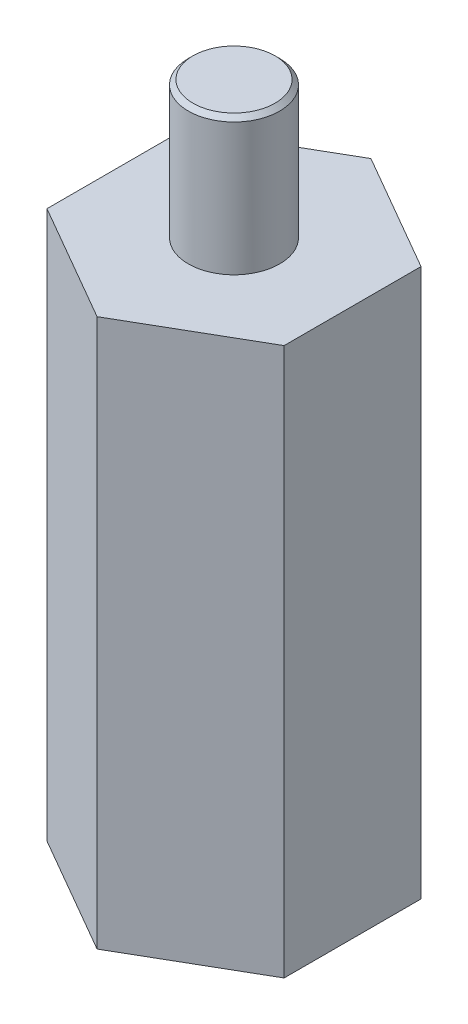
ISO-10303-21;
HEADER;
FILE_DESCRIPTION(('STEP AP214'),'2;1');
FILE_NAME('part.step','',(''),(''),'','','');
FILE_SCHEMA(('AUTOMOTIVE_DESIGN { 1 0 10303 214 1 1 1 1 }'));
ENDSEC;
DATA;
#1=APPLICATION_CONTEXT('core data for automotive mechanical design processes');
#2=APPLICATION_PROTOCOL_DEFINITION('international standard','automotive_design',2000,#1);
#3=PRODUCT_CONTEXT('',#1,'mechanical');
#4=PRODUCT('Part','Part','',(#3));
#5=PRODUCT_RELATED_PRODUCT_CATEGORY('part','',(#4));
#6=PRODUCT_DEFINITION_FORMATION('','',#4);
#7=PRODUCT_DEFINITION_CONTEXT('part definition',#1,'design');
#8=PRODUCT_DEFINITION('design','',#6,#7);
#9=PRODUCT_DEFINITION_SHAPE('','',#8);
#10=(LENGTH_UNIT() NAMED_UNIT(*) SI_UNIT(.MILLI.,.METRE.));
#11=(NAMED_UNIT(*) PLANE_ANGLE_UNIT() SI_UNIT($,.RADIAN.));
#12=(NAMED_UNIT(*) SI_UNIT($,.STERADIAN.) SOLID_ANGLE_UNIT());
#13=UNCERTAINTY_MEASURE_WITH_UNIT(LENGTH_MEASURE(1.E-05),#10,'distance_accuracy_value','');
#14=(GEOMETRIC_REPRESENTATION_CONTEXT(3) GLOBAL_UNCERTAINTY_ASSIGNED_CONTEXT((#13)) GLOBAL_UNIT_ASSIGNED_CONTEXT((#10,
#11,#12)) REPRESENTATION_CONTEXT('',''));
#15=CARTESIAN_POINT('',(0.,0.,0.));
#16=DIRECTION('',(0.,0.,1.));
#17=DIRECTION('',(1.,0.,0.));
#18=AXIS2_PLACEMENT_3D('',#15,#16,#17);
#19=CARTESIAN_POINT('',(2.59807621135329,12.,-1.50000000000003));
#20=DIRECTION('',(-0.499999999999995,0.,0.866025403784441));
#21=DIRECTION('',(0.866025403784442,0.,0.499999999999995));
#22=AXIS2_PLACEMENT_3D('',#19,#20,#21);
#23=PLANE('',#22);
#24=DIRECTION('',(-0.866025403784442,0.,-0.499999999999995));
#25=VECTOR('',#24,1.);
#26=CARTESIAN_POINT('',(2.59807621135329,0.,-1.50000000000003));
#27=LINE('',#26,#25);
#28=CARTESIAN_POINT('',(2.59807621135329,0.,-1.50000000000003));
#29=VERTEX_POINT('',#28);
#30=CARTESIAN_POINT('',(0.,0.,-2.99999999999999));
#31=VERTEX_POINT('',#30);
#32=EDGE_CURVE('E131',#29,#31,#27,.T.);
#33=ORIENTED_EDGE('',*,*,#32,.T.);
#34=DIRECTION('',(0.,-1.,0.));
#35=VECTOR('',#34,1.);
#36=CARTESIAN_POINT('',(0.,12.,-2.99999999999999));
#37=LINE('',#36,#35);
#38=CARTESIAN_POINT('',(0.,12.,-2.99999999999999));
#39=VERTEX_POINT('',#38);
#40=EDGE_CURVE('E149',#39,#31,#37,.T.);
#41=ORIENTED_EDGE('',*,*,#40,.F.);
#42=DIRECTION('',(-0.866025403784442,0.,-0.499999999999995));
#43=VECTOR('',#42,1.);
#44=CARTESIAN_POINT('',(2.59807621135329,12.,-1.50000000000003));
#45=LINE('',#44,#43);
#46=CARTESIAN_POINT('',(2.59807621135329,12.,-1.50000000000003));
#47=VERTEX_POINT('',#46);
#48=EDGE_CURVE('E142',#47,#39,#45,.T.);
#49=ORIENTED_EDGE('',*,*,#48,.F.);
#50=DIRECTION('',(0.,-1.,0.));
#51=VECTOR('',#50,1.);
#52=CARTESIAN_POINT('',(2.59807621135329,12.,-1.50000000000003));
#53=LINE('',#52,#51);
#54=EDGE_CURVE('E127',#47,#29,#53,.T.);
#55=ORIENTED_EDGE('',*,*,#54,.T.);
#56=EDGE_LOOP('',(#33,#41,#49,#55));
#57=FACE_BOUND('',#56,.T.);
#58=ADVANCED_FACE('F42',(#57),#23,.F.);
#59=CARTESIAN_POINT('',(0.,12.,-2.99999999999999));
#60=DIRECTION('',(0.500000000000001,0.,0.866025403784438));
#61=DIRECTION('',(0.866025403784438,0.,-0.500000000000001));
#62=AXIS2_PLACEMENT_3D('',#59,#60,#61);
#63=PLANE('',#62);
#64=DIRECTION('',(-0.866025403784438,0.,0.500000000000001));
#65=VECTOR('',#64,1.);
#66=CARTESIAN_POINT('',(0.,0.,-2.99999999999999));
#67=LINE('',#66,#65);
#68=CARTESIAN_POINT('',(-2.59807621135331,0.,-1.49999999999999));
#69=VERTEX_POINT('',#68);
#70=EDGE_CURVE('E134',#31,#69,#67,.T.);
#71=ORIENTED_EDGE('',*,*,#70,.T.);
#72=DIRECTION('',(0.,-1.,0.));
#73=VECTOR('',#72,1.);
#74=CARTESIAN_POINT('',(-2.59807621135331,12.,-1.49999999999999));
#75=LINE('',#74,#73);
#76=CARTESIAN_POINT('',(-2.59807621135331,12.,-1.49999999999999));
#77=VERTEX_POINT('',#76);
#78=EDGE_CURVE('E146',#77,#69,#75,.T.);
#79=ORIENTED_EDGE('',*,*,#78,.F.);
#80=DIRECTION('',(-0.866025403784438,0.,0.500000000000001));
#81=VECTOR('',#80,1.);
#82=CARTESIAN_POINT('',(0.,12.,-2.99999999999999));
#83=LINE('',#82,#81);
#84=EDGE_CURVE('E99',#39,#77,#83,.T.);
#85=ORIENTED_EDGE('',*,*,#84,.F.);
#86=ORIENTED_EDGE('',*,*,#40,.T.);
#87=EDGE_LOOP('',(#71,#79,#85,#86));
#88=FACE_BOUND('',#87,.T.);
#89=ADVANCED_FACE('F164',(#88),#63,.F.);
#90=CARTESIAN_POINT('',(-2.59807621135331,12.,-1.49999999999999));
#91=DIRECTION('',(1.,0.,0.));
#92=DIRECTION('',(0.,0.,-1.));
#93=AXIS2_PLACEMENT_3D('',#90,#91,#92);
#94=PLANE('',#93);
#95=DIRECTION('',(0.,0.,1.));
#96=VECTOR('',#95,1.);
#97=CARTESIAN_POINT('',(-2.59807621135331,0.,-1.49999999999999));
#98=LINE('',#97,#96);
#99=CARTESIAN_POINT('',(-2.5980762113533,0.,1.50000000000001));
#100=VERTEX_POINT('',#99);
#101=EDGE_CURVE('E137',#69,#100,#98,.T.);
#102=ORIENTED_EDGE('',*,*,#101,.T.);
#103=DIRECTION('',(0.,-1.,0.));
#104=VECTOR('',#103,1.);
#105=CARTESIAN_POINT('',(-2.5980762113533,12.,1.50000000000001));
#106=LINE('',#105,#104);
#107=CARTESIAN_POINT('',(-2.5980762113533,12.,1.50000000000001));
#108=VERTEX_POINT('',#107);
#109=EDGE_CURVE('E122',#108,#100,#106,.T.);
#110=ORIENTED_EDGE('',*,*,#109,.F.);
#111=DIRECTION('',(0.,0.,1.));
#112=VECTOR('',#111,1.);
#113=CARTESIAN_POINT('',(-2.59807621135331,12.,-1.49999999999999));
#114=LINE('',#113,#112);
#115=EDGE_CURVE('E113',#77,#108,#114,.T.);
#116=ORIENTED_EDGE('',*,*,#115,.F.);
#117=ORIENTED_EDGE('',*,*,#78,.T.);
#118=EDGE_LOOP('',(#102,#110,#116,#117));
#119=FACE_BOUND('',#118,.T.);
#120=ADVANCED_FACE('F167',(#119),#94,.F.);
#121=CARTESIAN_POINT('',(-2.5980762113533,12.,1.50000000000001));
#122=DIRECTION('',(0.499999999999995,0.,-0.866025403784442));
#123=DIRECTION('',(-0.866025403784442,0.,-0.499999999999995));
#124=AXIS2_PLACEMENT_3D('',#121,#122,#123);
#125=PLANE('',#124);
#126=DIRECTION('',(0.866025403784442,0.,0.499999999999995));
#127=VECTOR('',#126,1.);
#128=CARTESIAN_POINT('',(-2.5980762113533,0.,1.50000000000001));
#129=LINE('',#128,#127);
#130=CARTESIAN_POINT('',(0.,0.,2.99999999999999));
#131=VERTEX_POINT('',#130);
#132=EDGE_CURVE('E121',#100,#131,#129,.T.);
#133=ORIENTED_EDGE('',*,*,#132,.T.);
#134=DIRECTION('',(0.,-1.,0.));
#135=VECTOR('',#134,1.);
#136=CARTESIAN_POINT('',(0.,12.,2.99999999999999));
#137=LINE('',#136,#135);
#138=CARTESIAN_POINT('',(0.,12.,2.99999999999999));
#139=VERTEX_POINT('',#138);
#140=EDGE_CURVE('E118',#139,#131,#137,.T.);
#141=ORIENTED_EDGE('',*,*,#140,.F.);
#142=DIRECTION('',(0.866025403784442,0.,0.499999999999995));
#143=VECTOR('',#142,1.);
#144=CARTESIAN_POINT('',(-2.5980762113533,12.,1.50000000000001));
#145=LINE('',#144,#143);
#146=EDGE_CURVE('E107',#108,#139,#145,.T.);
#147=ORIENTED_EDGE('',*,*,#146,.F.);
#148=ORIENTED_EDGE('',*,*,#109,.T.);
#149=EDGE_LOOP('',(#133,#141,#147,#148));
#150=FACE_BOUND('',#149,.T.);
#151=ADVANCED_FACE('F119',(#150),#125,.F.);
#152=CARTESIAN_POINT('',(0.,12.,2.99999999999999));
#153=DIRECTION('',(-0.500000000000007,0.,-0.866025403784435));
#154=DIRECTION('',(-0.866025403784435,0.,0.500000000000007));
#155=AXIS2_PLACEMENT_3D('',#152,#153,#154);
#156=PLANE('',#155);
#157=DIRECTION('',(0.866025403784435,0.,-0.500000000000007));
#158=VECTOR('',#157,1.);
#159=CARTESIAN_POINT('',(0.,0.,2.99999999999999));
#160=LINE('',#159,#158);
#161=CARTESIAN_POINT('',(2.59807621135332,0.,1.49999999999997));
#162=VERTEX_POINT('',#161);
#163=EDGE_CURVE('E84',#131,#162,#160,.T.);
#164=ORIENTED_EDGE('',*,*,#163,.T.);
#165=DIRECTION('',(0.,-1.,0.));
#166=VECTOR('',#165,1.);
#167=CARTESIAN_POINT('',(2.59807621135332,12.,1.49999999999997));
#168=LINE('',#167,#166);
#169=CARTESIAN_POINT('',(2.59807621135332,12.,1.49999999999997));
#170=VERTEX_POINT('',#169);
#171=EDGE_CURVE('E123',#170,#162,#168,.T.);
#172=ORIENTED_EDGE('',*,*,#171,.F.);
#173=DIRECTION('',(0.866025403784435,0.,-0.500000000000007));
#174=VECTOR('',#173,1.);
#175=CARTESIAN_POINT('',(0.,12.,2.99999999999999));
#176=LINE('',#175,#174);
#177=EDGE_CURVE('E111',#139,#170,#176,.T.);
#178=ORIENTED_EDGE('',*,*,#177,.F.);
#179=ORIENTED_EDGE('',*,*,#140,.T.);
#180=EDGE_LOOP('',(#164,#172,#178,#179));
#181=FACE_BOUND('',#180,.T.);
#182=ADVANCED_FACE('F125',(#181),#156,.F.);
#183=CARTESIAN_POINT('',(2.59807621135332,12.,1.49999999999997));
#184=DIRECTION('',(-1.,0.,0.));
#185=DIRECTION('',(0.,0.,1.));
#186=AXIS2_PLACEMENT_3D('',#183,#184,#185);
#187=PLANE('',#186);
#188=DIRECTION('',(0.,0.,-1.));
#189=VECTOR('',#188,1.);
#190=CARTESIAN_POINT('',(2.59807621135332,0.,1.49999999999997));
#191=LINE('',#190,#189);
#192=EDGE_CURVE('E90',#162,#29,#191,.T.);
#193=ORIENTED_EDGE('',*,*,#192,.T.);
#194=ORIENTED_EDGE('',*,*,#54,.F.);
#195=DIRECTION('',(0.,0.,-1.));
#196=VECTOR('',#195,1.);
#197=CARTESIAN_POINT('',(2.59807621135332,12.,1.49999999999997));
#198=LINE('',#197,#196);
#199=EDGE_CURVE('E60',#170,#47,#198,.T.);
#200=ORIENTED_EDGE('',*,*,#199,.F.);
#201=ORIENTED_EDGE('',*,*,#171,.T.);
#202=EDGE_LOOP('',(#193,#194,#200,#201));
#203=FACE_BOUND('',#202,.T.);
#204=ADVANCED_FACE('F172',(#203),#187,.F.);
#205=CARTESIAN_POINT('',(0.,12.,0.));
#206=DIRECTION('',(0.,1.,0.));
#207=DIRECTION('',(0.,0.,1.));
#208=AXIS2_PLACEMENT_3D('',#205,#206,#207);
#209=PLANE('',#208);
#210=CARTESIAN_POINT('',(0.,12.,0.));
#211=DIRECTION('',(0.,1.,0.));
#212=DIRECTION('',(0.,0.,1.));
#213=AXIS2_PLACEMENT_3D('',#210,#211,#212);
#214=CIRCLE('',#213,1.);
#215=CARTESIAN_POINT('',(0.,12.,1.));
#216=VERTEX_POINT('',#215);
#217=EDGE_CURVE('E150',#216,#216,#214,.T.);
#218=ORIENTED_EDGE('',*,*,#217,.F.);
#219=EDGE_LOOP('',(#218));
#220=FACE_BOUND('',#219,.T.);
#221=ORIENTED_EDGE('',*,*,#48,.T.);
#222=ORIENTED_EDGE('',*,*,#84,.T.);
#223=ORIENTED_EDGE('',*,*,#115,.T.);
#224=ORIENTED_EDGE('',*,*,#146,.T.);
#225=ORIENTED_EDGE('',*,*,#177,.T.);
#226=ORIENTED_EDGE('',*,*,#199,.T.);
#227=EDGE_LOOP('',(#221,#222,#223,#224,#225,#226));
#228=FACE_BOUND('',#227,.T.);
#229=ADVANCED_FACE('F109',(#220,#228),#209,.T.);
#230=CARTESIAN_POINT('',(0.,0.,0.));
#231=DIRECTION('',(0.,1.,0.));
#232=DIRECTION('',(0.,0.,1.));
#233=AXIS2_PLACEMENT_3D('',#230,#231,#232);
#234=PLANE('',#233);
#235=CARTESIAN_POINT('',(0.,0.,0.));
#236=DIRECTION('',(0.,-1.,0.));
#237=DIRECTION('',(0.,0.,-1.));
#238=AXIS2_PLACEMENT_3D('',#235,#236,#237);
#239=CIRCLE('',#238,1.02499999999999);
#240=CARTESIAN_POINT('',(0.,0.,-1.02499999999999));
#241=VERTEX_POINT('',#240);
#242=EDGE_CURVE('E291',#241,#241,#239,.T.);
#243=ORIENTED_EDGE('',*,*,#242,.F.);
#244=EDGE_LOOP('',(#243));
#245=FACE_BOUND('',#244,.T.);
#246=ORIENTED_EDGE('',*,*,#32,.F.);
#247=ORIENTED_EDGE('',*,*,#192,.F.);
#248=ORIENTED_EDGE('',*,*,#163,.F.);
#249=ORIENTED_EDGE('',*,*,#132,.F.);
#250=ORIENTED_EDGE('',*,*,#101,.F.);
#251=ORIENTED_EDGE('',*,*,#70,.F.);
#252=EDGE_LOOP('',(#246,#247,#248,#249,#250,#251));
#253=FACE_BOUND('',#252,.T.);
#254=ADVANCED_FACE('F170',(#245,#253),#234,.F.);
#255=CARTESIAN_POINT('',(0.,15.,0.));
#256=DIRECTION('',(0.,-1.,0.));
#257=DIRECTION('',(0.,0.,-1.));
#258=AXIS2_PLACEMENT_3D('',#255,#256,#257);
#259=CYLINDRICAL_SURFACE('',#258,1.);
#260=CARTESIAN_POINT('',(0.,14.9,0.));
#261=DIRECTION('',(0.,1.,0.));
#262=DIRECTION('',(0.,0.,1.));
#263=AXIS2_PLACEMENT_3D('',#260,#261,#262);
#264=CIRCLE('',#263,1.);
#265=CARTESIAN_POINT('',(0.,14.9,-1.));
#266=VERTEX_POINT('',#265);
#267=EDGE_CURVE('E11',#266,#266,#264,.F.);
#268=ORIENTED_EDGE('',*,*,#267,.T.);
#269=EDGE_LOOP('',(#268));
#270=FACE_BOUND('',#269,.T.);
#271=ORIENTED_EDGE('',*,*,#217,.T.);
#272=EDGE_LOOP('',(#271));
#273=FACE_BOUND('',#272,.T.);
#274=ADVANCED_FACE('F220',(#270,#273),#259,.T.);
#275=CARTESIAN_POINT('',(0.,15.,0.));
#276=DIRECTION('',(0.,1.,0.));
#277=DIRECTION('',(0.,0.,1.));
#278=AXIS2_PLACEMENT_3D('',#275,#276,#277);
#279=PLANE('',#278);
#280=CARTESIAN_POINT('',(0.,15.,0.));
#281=DIRECTION('',(0.,1.,0.));
#282=DIRECTION('',(0.,0.,1.));
#283=AXIS2_PLACEMENT_3D('',#280,#281,#282);
#284=CIRCLE('',#283,0.900000000000005);
#285=CARTESIAN_POINT('',(0.,15.,-0.900000000000006));
#286=VERTEX_POINT('',#285);
#287=EDGE_CURVE('E52',#286,#286,#284,.T.);
#288=ORIENTED_EDGE('',*,*,#287,.T.);
#289=EDGE_LOOP('',(#288));
#290=FACE_BOUND('',#289,.T.);
#291=ADVANCED_FACE('F234',(#290),#279,.T.);
#292=CARTESIAN_POINT('',(0.,10.,0.));
#293=DIRECTION('',(0.,-1.,0.));
#294=DIRECTION('',(0.,0.,-1.));
#295=AXIS2_PLACEMENT_3D('',#292,#293,#294);
#296=CONICAL_SURFACE('',#295,1.025,1.02974425867665);
#297=CARTESIAN_POINT('',(0.,10.6158821345033,0.));
#298=VERTEX_POINT('',#297);
#299=VERTEX_LOOP('',#298);
#300=FACE_BOUND('',#299,.T.);
#301=CARTESIAN_POINT('',(0.,10.,0.));
#302=DIRECTION('',(0.,-1.,0.));
#303=DIRECTION('',(0.,0.,-1.));
#304=AXIS2_PLACEMENT_3D('',#301,#302,#303);
#305=CIRCLE('',#304,1.025);
#306=CARTESIAN_POINT('',(0.,10.,-1.025));
#307=VERTEX_POINT('',#306);
#308=EDGE_CURVE('E135',#307,#307,#305,.T.);
#309=ORIENTED_EDGE('',*,*,#308,.T.);
#310=EDGE_LOOP('',(#309));
#311=FACE_BOUND('',#310,.T.);
#312=ADVANCED_FACE('F228',(#300,#311),#296,.F.);
#313=CARTESIAN_POINT('',(0.,0.,0.));
#314=DIRECTION('',(0.,-1.,0.));
#315=DIRECTION('',(0.,0.,-1.));
#316=AXIS2_PLACEMENT_3D('',#313,#314,#315);
#317=CYLINDRICAL_SURFACE('',#316,1.02499999999999);
#318=ORIENTED_EDGE('',*,*,#308,.F.);
#319=EDGE_LOOP('',(#318));
#320=FACE_BOUND('',#319,.T.);
#321=ORIENTED_EDGE('',*,*,#242,.T.);
#322=EDGE_LOOP('',(#321));
#323=FACE_BOUND('',#322,.T.);
#324=ADVANCED_FACE('F233',(#320,#323),#317,.F.);
#325=CARTESIAN_POINT('',(0.,15.,0.));
#326=DIRECTION('',(0.,-1.,0.));
#327=DIRECTION('',(0.,0.,-1.));
#328=AXIS2_PLACEMENT_3D('',#325,#326,#327);
#329=CONICAL_SURFACE('',#328,0.900000000000005,0.785398163397453);
#330=CARTESIAN_POINT('',(0.,14.9,-1.));
#331=CARTESIAN_POINT('',(0.,14.9010416666667,-0.998958333333334));
#332=CARTESIAN_POINT('',(0.,14.9020833333333,-0.997916666666668));
#333=CARTESIAN_POINT('',(0.,14.9041666666667,-0.995833333333334));
#334=CARTESIAN_POINT('',(0.,14.9052083333333,-0.994791666666668));
#335=CARTESIAN_POINT('',(0.,14.9072916666667,-0.992708333333335));
#336=CARTESIAN_POINT('',(0.,14.9083333333333,-0.991666666666668));
#337=CARTESIAN_POINT('',(0.,14.9104166666667,-0.989583333333335));
#338=CARTESIAN_POINT('',(0.,14.9114583333333,-0.988541666666668));
#339=CARTESIAN_POINT('',(0.,14.9135416666667,-0.986458333333335));
#340=CARTESIAN_POINT('',(0.,14.9145833333333,-0.985416666666668));
#341=CARTESIAN_POINT('',(0.,14.9166666666667,-0.983333333333335));
#342=CARTESIAN_POINT('',(0.,14.9177083333333,-0.982291666666668));
#343=CARTESIAN_POINT('',(0.,14.9197916666667,-0.980208333333335));
#344=CARTESIAN_POINT('',(0.,14.9208333333333,-0.979166666666669));
#345=CARTESIAN_POINT('',(0.,14.9229166666667,-0.977083333333335));
#346=CARTESIAN_POINT('',(0.,14.9239583333333,-0.976041666666669));
#347=CARTESIAN_POINT('',(0.,14.9260416666667,-0.973958333333335));
#348=CARTESIAN_POINT('',(0.,14.9270833333333,-0.972916666666669));
#349=CARTESIAN_POINT('',(0.,14.9291666666667,-0.970833333333336));
#350=CARTESIAN_POINT('',(0.,14.9302083333333,-0.969791666666669));
#351=CARTESIAN_POINT('',(0.,14.9322916666667,-0.967708333333336));
#352=CARTESIAN_POINT('',(0.,14.9333333333333,-0.966666666666669));
#353=CARTESIAN_POINT('',(0.,14.9354166666667,-0.964583333333336));
#354=CARTESIAN_POINT('',(0.,14.9364583333333,-0.963541666666669));
#355=CARTESIAN_POINT('',(0.,14.9385416666667,-0.961458333333336));
#356=CARTESIAN_POINT('',(0.,14.9395833333333,-0.960416666666669));
#357=CARTESIAN_POINT('',(0.,14.9416666666667,-0.958333333333336));
#358=CARTESIAN_POINT('',(0.,14.9427083333333,-0.95729166666667));
#359=CARTESIAN_POINT('',(0.,14.9447916666667,-0.955208333333336));
#360=CARTESIAN_POINT('',(0.,14.9458333333333,-0.95416666666667));
#361=CARTESIAN_POINT('',(0.,14.9479166666667,-0.952083333333337));
#362=CARTESIAN_POINT('',(0.,14.9489583333333,-0.95104166666667));
#363=CARTESIAN_POINT('',(0.,14.9510416666667,-0.948958333333337));
#364=CARTESIAN_POINT('',(0.,14.9520833333333,-0.94791666666667));
#365=CARTESIAN_POINT('',(0.,14.9541666666667,-0.945833333333337));
#366=CARTESIAN_POINT('',(0.,14.9552083333333,-0.94479166666667));
#367=CARTESIAN_POINT('',(0.,14.9572916666667,-0.942708333333337));
#368=CARTESIAN_POINT('',(0.,14.9583333333333,-0.941666666666671));
#369=CARTESIAN_POINT('',(0.,14.9604166666667,-0.939583333333337));
#370=CARTESIAN_POINT('',(0.,14.9614583333333,-0.938541666666671));
#371=CARTESIAN_POINT('',(0.,14.9635416666667,-0.936458333333337));
#372=CARTESIAN_POINT('',(0.,14.9645833333333,-0.935416666666671));
#373=CARTESIAN_POINT('',(0.,14.9666666666667,-0.933333333333337));
#374=CARTESIAN_POINT('',(0.,14.9677083333333,-0.932291666666671));
#375=CARTESIAN_POINT('',(0.,14.9697916666667,-0.930208333333338));
#376=CARTESIAN_POINT('',(0.,14.9708333333333,-0.929166666666671));
#377=CARTESIAN_POINT('',(0.,14.9729166666667,-0.927083333333338));
#378=CARTESIAN_POINT('',(0.,14.9739583333333,-0.926041666666671));
#379=CARTESIAN_POINT('',(0.,14.9760416666667,-0.923958333333338));
#380=CARTESIAN_POINT('',(0.,14.9770833333333,-0.922916666666671));
#381=CARTESIAN_POINT('',(0.,14.9791666666667,-0.920833333333338));
#382=CARTESIAN_POINT('',(0.,14.9802083333333,-0.919791666666672));
#383=CARTESIAN_POINT('',(0.,14.9822916666667,-0.917708333333338));
#384=CARTESIAN_POINT('',(0.,14.9833333333333,-0.916666666666672));
#385=CARTESIAN_POINT('',(0.,14.9854166666667,-0.914583333333338));
#386=CARTESIAN_POINT('',(0.,14.9864583333333,-0.913541666666672));
#387=CARTESIAN_POINT('',(0.,14.9885416666667,-0.911458333333339));
#388=CARTESIAN_POINT('',(0.,14.9895833333333,-0.910416666666672));
#389=CARTESIAN_POINT('',(0.,14.9916666666667,-0.908333333333339));
#390=CARTESIAN_POINT('',(0.,14.9927083333333,-0.907291666666672));
#391=CARTESIAN_POINT('',(0.,14.9947916666667,-0.905208333333339));
#392=CARTESIAN_POINT('',(0.,14.9958333333333,-0.904166666666672));
#393=CARTESIAN_POINT('',(0.,14.9979166666667,-0.902083333333339));
#394=CARTESIAN_POINT('',(0.,14.9989583333333,-0.901041666666672));
#395=CARTESIAN_POINT('',(0.,15.,-0.900000000000006));
#396=B_SPLINE_CURVE_WITH_KNOTS('',3,(#330,#331,#332,#333,#334,#335,#336,#337,#338,#339,#340,
#341,#342,#343,#344,#345,#346,#347,#348,#349,#350,#351,#352,#353,#354,#355,#356,#357,#358,#359,
#360,#361,#362,#363,#364,#365,#366,#367,#368,#369,#370,#371,#372,#373,#374,#375,#376,#377,#378,
#379,#380,#381,#382,#383,#384,#385,#386,#387,#388,#389,#390,#391,#392,#393,#394,#395),
.UNSPECIFIED.,.F.,.F.,(4,2,2,2,2,2,2,2,2,2,2,2,2,2,2,2,2,2,2,2,2,2,2,2,2,2,2,2,2,2,2,2,4),(0.,
0.00441941738241559,0.00883883476483118,0.0132582521472468,0.0176776695296622,
0.0220970869120778,0.0265165042944934,0.030935921676909,0.0353553390593246,0.0397747564417401,
0.0441941738241557,0.0486135912065725,0.0530330085889881,0.0574524259714037,0.0618718433538192,
0.0662912607362348,0.0707106781186504,0.0751300955010659,0.0795495128834814,0.083968930265897,
0.0883883476483126,0.0928077650307282,0.097227182413145,0.101646599795561,0.106066017177976,
0.110485434560392,0.114904851942807,0.119324269325223,0.123743686707638,0.128163104090054,
0.132582521472469,0.137001938854885,0.141421356237302),.UNSPECIFIED.);
#397=EDGE_CURVE('BSEAM45',#266,#286,#396,.T.);
#398=ORIENTED_EDGE('',*,*,#267,.F.);
#399=ORIENTED_EDGE('',*,*,#287,.F.);
#400=ORIENTED_EDGE('',*,*,#397,.T.);
#401=ORIENTED_EDGE('',*,*,#397,.F.);
#402=EDGE_LOOP('',(#398,#400,#399,#401));
#403=FACE_BOUND('',#402,.T.);
#404=ADVANCED_FACE('F45',(#403),#329,.T.);
#405=CLOSED_SHELL('',(#58,#89,#120,#151,#182,#204,#229,#254,#274,#291,#312,#324,#404));
#406=MANIFOLD_SOLID_BREP('B2',#405);
#407=ADVANCED_BREP_SHAPE_REPRESENTATION('',(#18,#406),#14);
#408=SHAPE_DEFINITION_REPRESENTATION(#9,#407);
ENDSEC;
END-ISO-10303-21;
